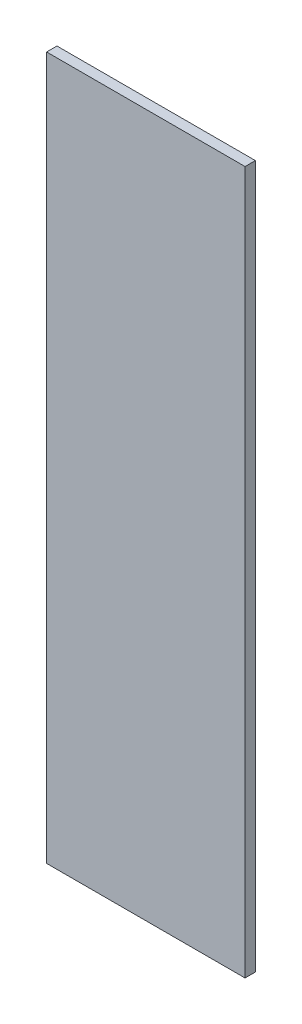
ISO-10303-21;
HEADER;
FILE_DESCRIPTION(('STEP AP214'),'2;1');
FILE_NAME('part.step','',(''),(''),'','','');
FILE_SCHEMA(('AUTOMOTIVE_DESIGN { 1 0 10303 214 1 1 1 1 }'));
ENDSEC;
DATA;
#1=APPLICATION_CONTEXT('core data for automotive mechanical design processes');
#2=APPLICATION_PROTOCOL_DEFINITION('international standard','automotive_design',2000,#1);
#3=PRODUCT_CONTEXT('',#1,'mechanical');
#4=PRODUCT('Part','Part','',(#3));
#5=PRODUCT_RELATED_PRODUCT_CATEGORY('part','',(#4));
#6=PRODUCT_DEFINITION_FORMATION('','',#4);
#7=PRODUCT_DEFINITION_CONTEXT('part definition',#1,'design');
#8=PRODUCT_DEFINITION('design','',#6,#7);
#9=PRODUCT_DEFINITION_SHAPE('','',#8);
#10=(LENGTH_UNIT() NAMED_UNIT(*) SI_UNIT(.MILLI.,.METRE.));
#11=(NAMED_UNIT(*) PLANE_ANGLE_UNIT() SI_UNIT($,.RADIAN.));
#12=(NAMED_UNIT(*) SI_UNIT($,.STERADIAN.) SOLID_ANGLE_UNIT());
#13=UNCERTAINTY_MEASURE_WITH_UNIT(LENGTH_MEASURE(1.E-05),#10,'distance_accuracy_value','');
#14=(GEOMETRIC_REPRESENTATION_CONTEXT(3) GLOBAL_UNCERTAINTY_ASSIGNED_CONTEXT((#13)) GLOBAL_UNIT_ASSIGNED_CONTEXT((#10,
#11,#12)) REPRESENTATION_CONTEXT('',''));
#15=CARTESIAN_POINT('',(0.,0.,0.));
#16=DIRECTION('',(0.,0.,1.));
#17=DIRECTION('',(1.,0.,0.));
#18=AXIS2_PLACEMENT_3D('',#15,#16,#17);
#19=CARTESIAN_POINT('',(48.,-170.,2.5));
#20=DIRECTION('',(-1.,0.,0.));
#21=DIRECTION('',(0.,0.,1.));
#22=AXIS2_PLACEMENT_3D('',#19,#20,#21);
#23=PLANE('',#22);
#24=DIRECTION('',(0.,1.,0.));
#25=VECTOR('',#24,1.);
#26=CARTESIAN_POINT('',(48.,-170.,-2.5));
#27=LINE('',#26,#25);
#28=CARTESIAN_POINT('',(48.,-170.,-2.5));
#29=VERTEX_POINT('',#28);
#30=CARTESIAN_POINT('',(48.,170.,-2.5));
#31=VERTEX_POINT('',#30);
#32=EDGE_CURVE('E95',#29,#31,#27,.T.);
#33=ORIENTED_EDGE('',*,*,#32,.T.);
#34=DIRECTION('',(0.,0.,-1.));
#35=VECTOR('',#34,1.);
#36=CARTESIAN_POINT('',(48.,170.,2.5));
#37=LINE('',#36,#35);
#38=CARTESIAN_POINT('',(48.,170.,2.5));
#39=VERTEX_POINT('',#38);
#40=EDGE_CURVE('E11',#39,#31,#37,.T.);
#41=ORIENTED_EDGE('',*,*,#40,.F.);
#42=DIRECTION('',(0.,1.,0.));
#43=VECTOR('',#42,1.);
#44=CARTESIAN_POINT('',(48.,-170.,2.5));
#45=LINE('',#44,#43);
#46=CARTESIAN_POINT('',(48.,-170.,2.5));
#47=VERTEX_POINT('',#46);
#48=EDGE_CURVE('E83',#47,#39,#45,.T.);
#49=ORIENTED_EDGE('',*,*,#48,.F.);
#50=DIRECTION('',(0.,0.,-1.));
#51=VECTOR('',#50,1.);
#52=CARTESIAN_POINT('',(48.,-170.,2.5));
#53=LINE('',#52,#51);
#54=EDGE_CURVE('E91',#47,#29,#53,.T.);
#55=ORIENTED_EDGE('',*,*,#54,.T.);
#56=EDGE_LOOP('',(#33,#41,#49,#55));
#57=FACE_BOUND('',#56,.T.);
#58=ADVANCED_FACE('F32',(#57),#23,.F.);
#59=CARTESIAN_POINT('',(-48.,170.,2.5));
#60=DIRECTION('',(0.,-1.,0.));
#61=DIRECTION('',(0.,0.,-1.));
#62=AXIS2_PLACEMENT_3D('',#59,#60,#61);
#63=PLANE('',#62);
#64=DIRECTION('',(-1.,0.,0.));
#65=VECTOR('',#64,1.);
#66=CARTESIAN_POINT('',(-48.,170.,-2.5));
#67=LINE('',#66,#65);
#68=CARTESIAN_POINT('',(-48.,170.,-2.5));
#69=VERTEX_POINT('',#68);
#70=EDGE_CURVE('E87',#31,#69,#67,.T.);
#71=ORIENTED_EDGE('',*,*,#70,.T.);
#72=DIRECTION('',(0.,0.,-1.));
#73=VECTOR('',#72,1.);
#74=CARTESIAN_POINT('',(-48.,170.,2.5));
#75=LINE('',#74,#73);
#76=CARTESIAN_POINT('',(-48.,170.,2.5));
#77=VERTEX_POINT('',#76);
#78=EDGE_CURVE('E40',#77,#69,#75,.T.);
#79=ORIENTED_EDGE('',*,*,#78,.F.);
#80=DIRECTION('',(-1.,0.,0.));
#81=VECTOR('',#80,1.);
#82=CARTESIAN_POINT('',(-48.,170.,2.5));
#83=LINE('',#82,#81);
#84=EDGE_CURVE('E78',#39,#77,#83,.T.);
#85=ORIENTED_EDGE('',*,*,#84,.F.);
#86=ORIENTED_EDGE('',*,*,#40,.T.);
#87=EDGE_LOOP('',(#71,#79,#85,#86));
#88=FACE_BOUND('',#87,.T.);
#89=ADVANCED_FACE('F86',(#88),#63,.F.);
#90=CARTESIAN_POINT('',(-48.,-170.,2.5));
#91=DIRECTION('',(1.,0.,0.));
#92=DIRECTION('',(0.,0.,-1.));
#93=AXIS2_PLACEMENT_3D('',#90,#91,#92);
#94=PLANE('',#93);
#95=DIRECTION('',(0.,-1.,0.));
#96=VECTOR('',#95,1.);
#97=CARTESIAN_POINT('',(-48.,-170.,-2.5));
#98=LINE('',#97,#96);
#99=CARTESIAN_POINT('',(-48.,-170.,-2.5));
#100=VERTEX_POINT('',#99);
#101=EDGE_CURVE('E65',#69,#100,#98,.T.);
#102=ORIENTED_EDGE('',*,*,#101,.T.);
#103=DIRECTION('',(0.,0.,-1.));
#104=VECTOR('',#103,1.);
#105=CARTESIAN_POINT('',(-48.,-170.,2.5));
#106=LINE('',#105,#104);
#107=CARTESIAN_POINT('',(-48.,-170.,2.5));
#108=VERTEX_POINT('',#107);
#109=EDGE_CURVE('E88',#108,#100,#106,.T.);
#110=ORIENTED_EDGE('',*,*,#109,.F.);
#111=DIRECTION('',(0.,-1.,0.));
#112=VECTOR('',#111,1.);
#113=CARTESIAN_POINT('',(-48.,-170.,2.5));
#114=LINE('',#113,#112);
#115=EDGE_CURVE('E81',#77,#108,#114,.T.);
#116=ORIENTED_EDGE('',*,*,#115,.F.);
#117=ORIENTED_EDGE('',*,*,#78,.T.);
#118=EDGE_LOOP('',(#102,#110,#116,#117));
#119=FACE_BOUND('',#118,.T.);
#120=ADVANCED_FACE('F89',(#119),#94,.F.);
#121=CARTESIAN_POINT('',(-48.,-170.,2.5));
#122=DIRECTION('',(0.,1.,0.));
#123=DIRECTION('',(0.,0.,1.));
#124=AXIS2_PLACEMENT_3D('',#121,#122,#123);
#125=PLANE('',#124);
#126=DIRECTION('',(1.,0.,0.));
#127=VECTOR('',#126,1.);
#128=CARTESIAN_POINT('',(-48.,-170.,-2.5));
#129=LINE('',#128,#127);
#130=EDGE_CURVE('E71',#100,#29,#129,.T.);
#131=ORIENTED_EDGE('',*,*,#130,.T.);
#132=ORIENTED_EDGE('',*,*,#54,.F.);
#133=DIRECTION('',(1.,0.,0.));
#134=VECTOR('',#133,1.);
#135=CARTESIAN_POINT('',(-48.,-170.,2.5));
#136=LINE('',#135,#134);
#137=EDGE_CURVE('E48',#108,#47,#136,.T.);
#138=ORIENTED_EDGE('',*,*,#137,.F.);
#139=ORIENTED_EDGE('',*,*,#109,.T.);
#140=EDGE_LOOP('',(#131,#132,#138,#139));
#141=FACE_BOUND('',#140,.T.);
#142=ADVANCED_FACE('F102',(#141),#125,.F.);
#143=CARTESIAN_POINT('',(0.,0.,2.5));
#144=DIRECTION('',(0.,0.,-1.));
#145=DIRECTION('',(-1.,0.,0.));
#146=AXIS2_PLACEMENT_3D('',#143,#144,#145);
#147=PLANE('',#146);
#148=ORIENTED_EDGE('',*,*,#48,.T.);
#149=ORIENTED_EDGE('',*,*,#84,.T.);
#150=ORIENTED_EDGE('',*,*,#115,.T.);
#151=ORIENTED_EDGE('',*,*,#137,.T.);
#152=EDGE_LOOP('',(#148,#149,#150,#151));
#153=FACE_BOUND('',#152,.T.);
#154=ADVANCED_FACE('F79',(#153),#147,.F.);
#155=CARTESIAN_POINT('',(0.,0.,-2.5));
#156=DIRECTION('',(0.,0.,-1.));
#157=DIRECTION('',(-1.,0.,0.));
#158=AXIS2_PLACEMENT_3D('',#155,#156,#157);
#159=PLANE('',#158);
#160=ORIENTED_EDGE('',*,*,#32,.F.);
#161=ORIENTED_EDGE('',*,*,#130,.F.);
#162=ORIENTED_EDGE('',*,*,#101,.F.);
#163=ORIENTED_EDGE('',*,*,#70,.F.);
#164=EDGE_LOOP('',(#160,#161,#162,#163));
#165=FACE_BOUND('',#164,.T.);
#166=ADVANCED_FACE('F105',(#165),#159,.T.);
#167=CLOSED_SHELL('',(#58,#89,#120,#142,#154,#166));
#168=MANIFOLD_SOLID_BREP('B2',#167);
#169=ADVANCED_BREP_SHAPE_REPRESENTATION('',(#18,#168),#14);
#170=SHAPE_DEFINITION_REPRESENTATION(#9,#169);
ENDSEC;
END-ISO-10303-21;
